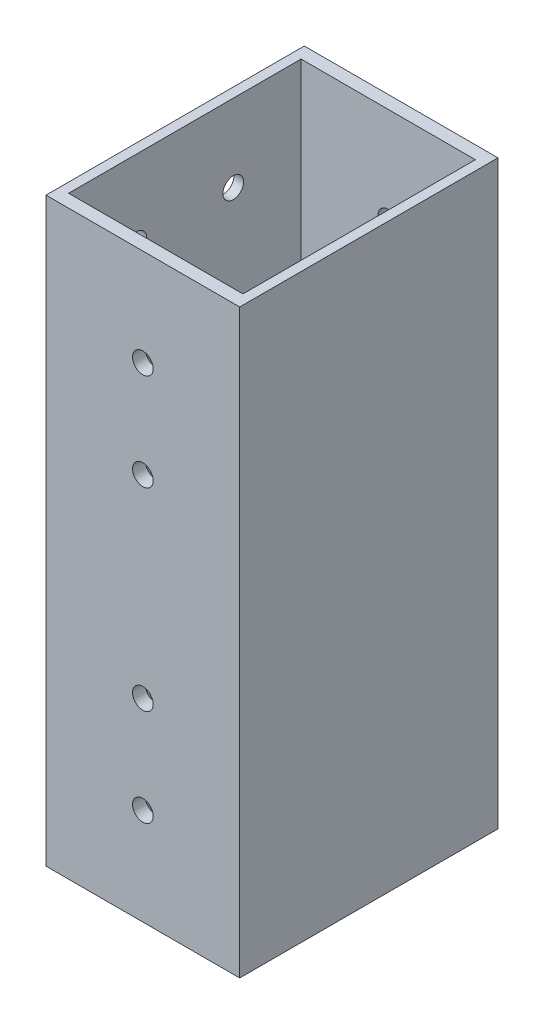
ISO-10303-21;
HEADER;
FILE_DESCRIPTION(('STEP AP214'),'2;1');
FILE_NAME('part.step','',(''),(''),'','','');
FILE_SCHEMA(('AUTOMOTIVE_DESIGN { 1 0 10303 214 1 1 1 1 }'));
ENDSEC;
DATA;
#1=APPLICATION_CONTEXT('core data for automotive mechanical design processes');
#2=APPLICATION_PROTOCOL_DEFINITION('international standard','automotive_design',2000,#1);
#3=PRODUCT_CONTEXT('',#1,'mechanical');
#4=PRODUCT('Part','Part','',(#3));
#5=PRODUCT_RELATED_PRODUCT_CATEGORY('part','',(#4));
#6=PRODUCT_DEFINITION_FORMATION('','',#4);
#7=PRODUCT_DEFINITION_CONTEXT('part definition',#1,'design');
#8=PRODUCT_DEFINITION('design','',#6,#7);
#9=PRODUCT_DEFINITION_SHAPE('','',#8);
#10=(LENGTH_UNIT() NAMED_UNIT(*) SI_UNIT(.MILLI.,.METRE.));
#11=(NAMED_UNIT(*) PLANE_ANGLE_UNIT() SI_UNIT($,.RADIAN.));
#12=(NAMED_UNIT(*) SI_UNIT($,.STERADIAN.) SOLID_ANGLE_UNIT());
#13=UNCERTAINTY_MEASURE_WITH_UNIT(LENGTH_MEASURE(1.E-05),#10,'distance_accuracy_value','');
#14=(GEOMETRIC_REPRESENTATION_CONTEXT(3) GLOBAL_UNCERTAINTY_ASSIGNED_CONTEXT((#13)) GLOBAL_UNIT_ASSIGNED_CONTEXT((#10,
#11,#12)) REPRESENTATION_CONTEXT('',''));
#15=CARTESIAN_POINT('',(0.,0.,0.));
#16=DIRECTION('',(0.,0.,1.));
#17=DIRECTION('',(1.,0.,0.));
#18=AXIS2_PLACEMENT_3D('',#15,#16,#17);
#19=CARTESIAN_POINT('',(0.,90.,0.));
#20=DIRECTION('',(0.,-1.,0.));
#21=DIRECTION('',(0.,0.,-1.));
#22=AXIS2_PLACEMENT_3D('',#19,#20,#21);
#23=PLANE('',#22);
#24=DIRECTION('',(0.,0.,-1.));
#25=VECTOR('',#24,1.);
#26=CARTESIAN_POINT('',(15.,90.,20.));
#27=LINE('',#26,#25);
#28=CARTESIAN_POINT('',(15.,90.,20.));
#29=VERTEX_POINT('',#28);
#30=CARTESIAN_POINT('',(15.,90.,-20.));
#31=VERTEX_POINT('',#30);
#32=EDGE_CURVE('E139',#29,#31,#27,.T.);
#33=ORIENTED_EDGE('',*,*,#32,.T.);
#34=DIRECTION('',(-1.,0.,0.));
#35=VECTOR('',#34,1.);
#36=CARTESIAN_POINT('',(-15.,90.,-20.));
#37=LINE('',#36,#35);
#38=CARTESIAN_POINT('',(-15.,90.,-20.));
#39=VERTEX_POINT('',#38);
#40=EDGE_CURVE('E142',#31,#39,#37,.T.);
#41=ORIENTED_EDGE('',*,*,#40,.T.);
#42=DIRECTION('',(0.,0.,1.));
#43=VECTOR('',#42,1.);
#44=CARTESIAN_POINT('',(-15.,90.,20.));
#45=LINE('',#44,#43);
#46=CARTESIAN_POINT('',(-15.,90.,20.));
#47=VERTEX_POINT('',#46);
#48=EDGE_CURVE('E145',#39,#47,#45,.T.);
#49=ORIENTED_EDGE('',*,*,#48,.T.);
#50=DIRECTION('',(1.,0.,0.));
#51=VECTOR('',#50,1.);
#52=CARTESIAN_POINT('',(-15.,90.,20.));
#53=LINE('',#52,#51);
#54=EDGE_CURVE('E147',#47,#29,#53,.T.);
#55=ORIENTED_EDGE('',*,*,#54,.T.);
#56=EDGE_LOOP('',(#33,#41,#49,#55));
#57=FACE_BOUND('',#56,.T.);
#58=DIRECTION('',(0.,0.,-1.));
#59=VECTOR('',#58,1.);
#60=CARTESIAN_POINT('',(13.5,90.,18.));
#61=LINE('',#60,#59);
#62=CARTESIAN_POINT('',(13.5,90.,18.));
#63=VERTEX_POINT('',#62);
#64=CARTESIAN_POINT('',(13.5,90.,-18.));
#65=VERTEX_POINT('',#64);
#66=EDGE_CURVE('E101',#63,#65,#61,.T.);
#67=ORIENTED_EDGE('',*,*,#66,.F.);
#68=DIRECTION('',(1.,0.,0.));
#69=VECTOR('',#68,1.);
#70=CARTESIAN_POINT('',(-13.5,90.,18.));
#71=LINE('',#70,#69);
#72=CARTESIAN_POINT('',(-13.5,90.,18.));
#73=VERTEX_POINT('',#72);
#74=EDGE_CURVE('E123',#73,#63,#71,.T.);
#75=ORIENTED_EDGE('',*,*,#74,.F.);
#76=DIRECTION('',(0.,0.,1.));
#77=VECTOR('',#76,1.);
#78=CARTESIAN_POINT('',(-13.5,90.,18.));
#79=LINE('',#78,#77);
#80=CARTESIAN_POINT('',(-13.5,90.,-18.));
#81=VERTEX_POINT('',#80);
#82=EDGE_CURVE('E121',#81,#73,#79,.T.);
#83=ORIENTED_EDGE('',*,*,#82,.F.);
#84=DIRECTION('',(-1.,0.,0.));
#85=VECTOR('',#84,1.);
#86=CARTESIAN_POINT('',(-13.5,90.,-18.));
#87=LINE('',#86,#85);
#88=EDGE_CURVE('E109',#65,#81,#87,.T.);
#89=ORIENTED_EDGE('',*,*,#88,.F.);
#90=EDGE_LOOP('',(#67,#75,#83,#89));
#91=FACE_BOUND('',#90,.T.);
#92=ADVANCED_FACE('F34',(#57,#91),#23,.F.);
#93=CARTESIAN_POINT('',(0.,0.,0.));
#94=DIRECTION('',(0.,-1.,0.));
#95=DIRECTION('',(0.,0.,-1.));
#96=AXIS2_PLACEMENT_3D('',#93,#94,#95);
#97=PLANE('',#96);
#98=DIRECTION('',(0.,0.,-1.));
#99=VECTOR('',#98,1.);
#100=CARTESIAN_POINT('',(15.,0.,20.));
#101=LINE('',#100,#99);
#102=CARTESIAN_POINT('',(15.,0.,20.));
#103=VERTEX_POINT('',#102);
#104=CARTESIAN_POINT('',(15.,0.,-20.));
#105=VERTEX_POINT('',#104);
#106=EDGE_CURVE('E117',#103,#105,#101,.T.);
#107=ORIENTED_EDGE('',*,*,#106,.F.);
#108=DIRECTION('',(1.,0.,0.));
#109=VECTOR('',#108,1.);
#110=CARTESIAN_POINT('',(-15.,0.,20.));
#111=LINE('',#110,#109);
#112=CARTESIAN_POINT('',(-15.,0.,20.));
#113=VERTEX_POINT('',#112);
#114=EDGE_CURVE('E143',#113,#103,#111,.T.);
#115=ORIENTED_EDGE('',*,*,#114,.F.);
#116=DIRECTION('',(0.,0.,1.));
#117=VECTOR('',#116,1.);
#118=CARTESIAN_POINT('',(-15.,0.,20.));
#119=LINE('',#118,#117);
#120=CARTESIAN_POINT('',(-15.,0.,-20.));
#121=VERTEX_POINT('',#120);
#122=EDGE_CURVE('E154',#121,#113,#119,.T.);
#123=ORIENTED_EDGE('',*,*,#122,.F.);
#124=DIRECTION('',(-1.,0.,0.));
#125=VECTOR('',#124,1.);
#126=CARTESIAN_POINT('',(-15.,0.,-20.));
#127=LINE('',#126,#125);
#128=EDGE_CURVE('E152',#105,#121,#127,.T.);
#129=ORIENTED_EDGE('',*,*,#128,.F.);
#130=EDGE_LOOP('',(#107,#115,#123,#129));
#131=FACE_BOUND('',#130,.T.);
#132=DIRECTION('',(1.,0.,0.));
#133=VECTOR('',#132,1.);
#134=CARTESIAN_POINT('',(-13.5,0.,18.));
#135=LINE('',#134,#133);
#136=CARTESIAN_POINT('',(-13.5,0.,18.));
#137=VERTEX_POINT('',#136);
#138=CARTESIAN_POINT('',(13.5,0.,18.));
#139=VERTEX_POINT('',#138);
#140=EDGE_CURVE('E110',#137,#139,#135,.T.);
#141=ORIENTED_EDGE('',*,*,#140,.T.);
#142=DIRECTION('',(0.,0.,-1.));
#143=VECTOR('',#142,1.);
#144=CARTESIAN_POINT('',(13.5,0.,18.));
#145=LINE('',#144,#143);
#146=CARTESIAN_POINT('',(13.5,0.,-18.));
#147=VERTEX_POINT('',#146);
#148=EDGE_CURVE('E59',#139,#147,#145,.T.);
#149=ORIENTED_EDGE('',*,*,#148,.T.);
#150=DIRECTION('',(-1.,0.,0.));
#151=VECTOR('',#150,1.);
#152=CARTESIAN_POINT('',(-13.5,0.,-18.));
#153=LINE('',#152,#151);
#154=CARTESIAN_POINT('',(-13.5,0.,-18.));
#155=VERTEX_POINT('',#154);
#156=EDGE_CURVE('E116',#147,#155,#153,.T.);
#157=ORIENTED_EDGE('',*,*,#156,.T.);
#158=DIRECTION('',(0.,0.,1.));
#159=VECTOR('',#158,1.);
#160=CARTESIAN_POINT('',(-13.5,0.,18.));
#161=LINE('',#160,#159);
#162=EDGE_CURVE('E131',#155,#137,#161,.T.);
#163=ORIENTED_EDGE('',*,*,#162,.T.);
#164=EDGE_LOOP('',(#141,#149,#157,#163));
#165=FACE_BOUND('',#164,.T.);
#166=ADVANCED_FACE('F264',(#131,#165),#97,.T.);
#167=CARTESIAN_POINT('',(15.,90.,20.));
#168=DIRECTION('',(-1.,0.,0.));
#169=DIRECTION('',(0.,0.,1.));
#170=AXIS2_PLACEMENT_3D('',#167,#168,#169);
#171=PLANE('',#170);
#172=ORIENTED_EDGE('',*,*,#106,.T.);
#173=DIRECTION('',(0.,-1.,0.));
#174=VECTOR('',#173,1.);
#175=CARTESIAN_POINT('',(15.,90.,-20.));
#176=LINE('',#175,#174);
#177=EDGE_CURVE('E11',#31,#105,#176,.T.);
#178=ORIENTED_EDGE('',*,*,#177,.F.);
#179=ORIENTED_EDGE('',*,*,#32,.F.);
#180=DIRECTION('',(0.,-1.,0.));
#181=VECTOR('',#180,1.);
#182=CARTESIAN_POINT('',(15.,90.,20.));
#183=LINE('',#182,#181);
#184=EDGE_CURVE('E149',#29,#103,#183,.T.);
#185=ORIENTED_EDGE('',*,*,#184,.T.);
#186=EDGE_LOOP('',(#172,#178,#179,#185));
#187=FACE_BOUND('',#186,.T.);
#188=ADVANCED_FACE('F36',(#187),#171,.F.);
#189=CARTESIAN_POINT('',(-15.,90.,-20.));
#190=DIRECTION('',(0.,0.,1.));
#191=DIRECTION('',(1.,0.,0.));
#192=AXIS2_PLACEMENT_3D('',#189,#190,#191);
#193=PLANE('',#192);
#194=CARTESIAN_POINT('',(0.,15.,-20.));
#195=DIRECTION('',(0.,0.,-1.));
#196=DIRECTION('',(-1.,0.,0.));
#197=AXIS2_PLACEMENT_3D('',#194,#195,#196);
#198=CIRCLE('',#197,1.6);
#199=CARTESIAN_POINT('',(-1.60000000000001,15.,-20.));
#200=VERTEX_POINT('',#199);
#201=EDGE_CURVE('E312',#200,#200,#198,.T.);
#202=ORIENTED_EDGE('',*,*,#201,.F.);
#203=EDGE_LOOP('',(#202));
#204=FACE_BOUND('',#203,.T.);
#205=CARTESIAN_POINT('',(0.,75.,-20.));
#206=DIRECTION('',(0.,0.,-1.));
#207=DIRECTION('',(-1.,0.,0.));
#208=AXIS2_PLACEMENT_3D('',#205,#206,#207);
#209=CIRCLE('',#208,1.6);
#210=CARTESIAN_POINT('',(-1.60000000000001,75.,-20.));
#211=VERTEX_POINT('',#210);
#212=EDGE_CURVE('E313',#211,#211,#209,.T.);
#213=ORIENTED_EDGE('',*,*,#212,.F.);
#214=EDGE_LOOP('',(#213));
#215=FACE_BOUND('',#214,.T.);
#216=CARTESIAN_POINT('',(0.,60.,-20.));
#217=DIRECTION('',(0.,0.,-1.));
#218=DIRECTION('',(-1.,0.,0.));
#219=AXIS2_PLACEMENT_3D('',#216,#217,#218);
#220=CIRCLE('',#219,1.6);
#221=CARTESIAN_POINT('',(-1.6,60.,-20.));
#222=VERTEX_POINT('',#221);
#223=EDGE_CURVE('E320',#222,#222,#220,.T.);
#224=ORIENTED_EDGE('',*,*,#223,.F.);
#225=EDGE_LOOP('',(#224));
#226=FACE_BOUND('',#225,.T.);
#227=CARTESIAN_POINT('',(0.,30.,-20.));
#228=DIRECTION('',(0.,0.,-1.));
#229=DIRECTION('',(-1.,0.,0.));
#230=AXIS2_PLACEMENT_3D('',#227,#228,#229);
#231=CIRCLE('',#230,1.6);
#232=CARTESIAN_POINT('',(-1.60000000000001,30.,-20.));
#233=VERTEX_POINT('',#232);
#234=EDGE_CURVE('E307',#233,#233,#231,.T.);
#235=ORIENTED_EDGE('',*,*,#234,.F.);
#236=EDGE_LOOP('',(#235));
#237=FACE_BOUND('',#236,.T.);
#238=ORIENTED_EDGE('',*,*,#128,.T.);
#239=DIRECTION('',(0.,-1.,0.));
#240=VECTOR('',#239,1.);
#241=CARTESIAN_POINT('',(-15.,90.,-20.));
#242=LINE('',#241,#240);
#243=EDGE_CURVE('E43',#39,#121,#242,.T.);
#244=ORIENTED_EDGE('',*,*,#243,.F.);
#245=ORIENTED_EDGE('',*,*,#40,.F.);
#246=ORIENTED_EDGE('',*,*,#177,.T.);
#247=EDGE_LOOP('',(#238,#244,#245,#246));
#248=FACE_BOUND('',#247,.T.);
#249=ADVANCED_FACE('F251',(#204,#215,#226,#237,#248),#193,.F.);
#250=CARTESIAN_POINT('',(-15.,90.,20.));
#251=DIRECTION('',(1.,0.,0.));
#252=DIRECTION('',(0.,0.,-1.));
#253=AXIS2_PLACEMENT_3D('',#250,#251,#252);
#254=PLANE('',#253);
#255=CARTESIAN_POINT('',(-15.,78.,-7.49999999999982));
#256=DIRECTION('',(-1.,0.,0.));
#257=DIRECTION('',(0.,0.,1.));
#258=AXIS2_PLACEMENT_3D('',#255,#256,#257);
#259=CIRCLE('',#258,1.6);
#260=CARTESIAN_POINT('',(-15.,78.,-5.89999999999982));
#261=VERTEX_POINT('',#260);
#262=EDGE_CURVE('E208',#261,#261,#259,.T.);
#263=ORIENTED_EDGE('',*,*,#262,.F.);
#264=EDGE_LOOP('',(#263));
#265=FACE_BOUND('',#264,.T.);
#266=CARTESIAN_POINT('',(-15.,62.,-7.49999999999982));
#267=DIRECTION('',(-1.,0.,0.));
#268=DIRECTION('',(0.,0.,1.));
#269=AXIS2_PLACEMENT_3D('',#266,#267,#268);
#270=CIRCLE('',#269,1.6);
#271=CARTESIAN_POINT('',(-15.,62.,-5.89999999999982));
#272=VERTEX_POINT('',#271);
#273=EDGE_CURVE('E215',#272,#272,#270,.T.);
#274=ORIENTED_EDGE('',*,*,#273,.F.);
#275=EDGE_LOOP('',(#274));
#276=FACE_BOUND('',#275,.T.);
#277=CARTESIAN_POINT('',(-15.,62.,7.50000000000019));
#278=DIRECTION('',(-1.,0.,0.));
#279=DIRECTION('',(0.,0.,1.));
#280=AXIS2_PLACEMENT_3D('',#277,#278,#279);
#281=CIRCLE('',#280,1.6);
#282=CARTESIAN_POINT('',(-15.,62.,9.10000000000019));
#283=VERTEX_POINT('',#282);
#284=EDGE_CURVE('E221',#283,#283,#281,.T.);
#285=ORIENTED_EDGE('',*,*,#284,.F.);
#286=EDGE_LOOP('',(#285));
#287=FACE_BOUND('',#286,.T.);
#288=CARTESIAN_POINT('',(-15.,11.9999999999997,7.50000000000035));
#289=DIRECTION('',(-1.,0.,0.));
#290=DIRECTION('',(0.,0.,1.));
#291=AXIS2_PLACEMENT_3D('',#288,#289,#290);
#292=CIRCLE('',#291,1.6);
#293=CARTESIAN_POINT('',(-15.,11.9999999999997,9.10000000000035));
#294=VERTEX_POINT('',#293);
#295=EDGE_CURVE('E227',#294,#294,#292,.T.);
#296=ORIENTED_EDGE('',*,*,#295,.F.);
#297=EDGE_LOOP('',(#296));
#298=FACE_BOUND('',#297,.T.);
#299=CARTESIAN_POINT('',(-15.,27.9999999999997,7.50000000000037));
#300=DIRECTION('',(-1.,0.,0.));
#301=DIRECTION('',(0.,0.,1.));
#302=AXIS2_PLACEMENT_3D('',#299,#300,#301);
#303=CIRCLE('',#302,1.6);
#304=CARTESIAN_POINT('',(-15.,27.9999999999997,9.10000000000037));
#305=VERTEX_POINT('',#304);
#306=EDGE_CURVE('E190',#305,#305,#303,.T.);
#307=ORIENTED_EDGE('',*,*,#306,.F.);
#308=EDGE_LOOP('',(#307));
#309=FACE_BOUND('',#308,.T.);
#310=CARTESIAN_POINT('',(-15.,27.9999999999997,-7.49999999999964));
#311=DIRECTION('',(-1.,0.,0.));
#312=DIRECTION('',(0.,0.,1.));
#313=AXIS2_PLACEMENT_3D('',#310,#311,#312);
#314=CIRCLE('',#313,1.6);
#315=CARTESIAN_POINT('',(-15.,27.9999999999997,-5.89999999999964));
#316=VERTEX_POINT('',#315);
#317=EDGE_CURVE('E197',#316,#316,#314,.T.);
#318=ORIENTED_EDGE('',*,*,#317,.F.);
#319=EDGE_LOOP('',(#318));
#320=FACE_BOUND('',#319,.T.);
#321=CARTESIAN_POINT('',(-15.,11.9999999999997,-7.49999999999966));
#322=DIRECTION('',(-1.,0.,0.));
#323=DIRECTION('',(0.,0.,1.));
#324=AXIS2_PLACEMENT_3D('',#321,#322,#323);
#325=CIRCLE('',#324,1.6);
#326=CARTESIAN_POINT('',(-15.,11.9999999999997,-5.89999999999966));
#327=VERTEX_POINT('',#326);
#328=EDGE_CURVE('E203',#327,#327,#325,.T.);
#329=ORIENTED_EDGE('',*,*,#328,.F.);
#330=EDGE_LOOP('',(#329));
#331=FACE_BOUND('',#330,.T.);
#332=CARTESIAN_POINT('',(-15.,78.,7.50000000000019));
#333=DIRECTION('',(-1.,0.,0.));
#334=DIRECTION('',(0.,0.,1.));
#335=AXIS2_PLACEMENT_3D('',#332,#333,#334);
#336=CIRCLE('',#335,1.6);
#337=CARTESIAN_POINT('',(-15.,78.,9.10000000000019));
#338=VERTEX_POINT('',#337);
#339=EDGE_CURVE('E129',#338,#338,#336,.T.);
#340=ORIENTED_EDGE('',*,*,#339,.F.);
#341=EDGE_LOOP('',(#340));
#342=FACE_BOUND('',#341,.T.);
#343=ORIENTED_EDGE('',*,*,#122,.T.);
#344=DIRECTION('',(0.,-1.,0.));
#345=VECTOR('',#344,1.);
#346=CARTESIAN_POINT('',(-15.,90.,20.));
#347=LINE('',#346,#345);
#348=EDGE_CURVE('E159',#47,#113,#347,.T.);
#349=ORIENTED_EDGE('',*,*,#348,.F.);
#350=ORIENTED_EDGE('',*,*,#48,.F.);
#351=ORIENTED_EDGE('',*,*,#243,.T.);
#352=EDGE_LOOP('',(#343,#349,#350,#351));
#353=FACE_BOUND('',#352,.T.);
#354=ADVANCED_FACE('F247',(#265,#276,#287,#298,#309,#320,#331,#342,#353),#254,.F.);
#355=CARTESIAN_POINT('',(-15.,90.,20.));
#356=DIRECTION('',(0.,0.,-1.));
#357=DIRECTION('',(-1.,0.,0.));
#358=AXIS2_PLACEMENT_3D('',#355,#356,#357);
#359=PLANE('',#358);
#360=CARTESIAN_POINT('',(0.,15.,20.));
#361=DIRECTION('',(0.,0.,-1.));
#362=DIRECTION('',(-1.,0.,0.));
#363=AXIS2_PLACEMENT_3D('',#360,#361,#362);
#364=CIRCLE('',#363,1.6);
#365=CARTESIAN_POINT('',(-1.60000000000001,15.,20.));
#366=VERTEX_POINT('',#365);
#367=EDGE_CURVE('E295',#366,#366,#364,.T.);
#368=ORIENTED_EDGE('',*,*,#367,.T.);
#369=EDGE_LOOP('',(#368));
#370=FACE_BOUND('',#369,.T.);
#371=CARTESIAN_POINT('',(0.,75.,20.));
#372=DIRECTION('',(0.,0.,-1.));
#373=DIRECTION('',(-1.,0.,0.));
#374=AXIS2_PLACEMENT_3D('',#371,#372,#373);
#375=CIRCLE('',#374,1.6);
#376=CARTESIAN_POINT('',(-1.60000000000001,75.,20.));
#377=VERTEX_POINT('',#376);
#378=EDGE_CURVE('E299',#377,#377,#375,.T.);
#379=ORIENTED_EDGE('',*,*,#378,.T.);
#380=EDGE_LOOP('',(#379));
#381=FACE_BOUND('',#380,.T.);
#382=CARTESIAN_POINT('',(0.,60.,20.));
#383=DIRECTION('',(0.,0.,-1.));
#384=DIRECTION('',(-1.,0.,0.));
#385=AXIS2_PLACEMENT_3D('',#382,#383,#384);
#386=CIRCLE('',#385,1.6);
#387=CARTESIAN_POINT('',(-1.6,60.,20.));
#388=VERTEX_POINT('',#387);
#389=EDGE_CURVE('E303',#388,#388,#386,.T.);
#390=ORIENTED_EDGE('',*,*,#389,.T.);
#391=EDGE_LOOP('',(#390));
#392=FACE_BOUND('',#391,.T.);
#393=CARTESIAN_POINT('',(0.,30.,20.));
#394=DIRECTION('',(0.,0.,-1.));
#395=DIRECTION('',(-1.,0.,0.));
#396=AXIS2_PLACEMENT_3D('',#393,#394,#395);
#397=CIRCLE('',#396,1.6);
#398=CARTESIAN_POINT('',(-1.60000000000001,30.,20.));
#399=VERTEX_POINT('',#398);
#400=EDGE_CURVE('E168',#399,#399,#397,.T.);
#401=ORIENTED_EDGE('',*,*,#400,.T.);
#402=EDGE_LOOP('',(#401));
#403=FACE_BOUND('',#402,.T.);
#404=ORIENTED_EDGE('',*,*,#114,.T.);
#405=ORIENTED_EDGE('',*,*,#184,.F.);
#406=ORIENTED_EDGE('',*,*,#54,.F.);
#407=ORIENTED_EDGE('',*,*,#348,.T.);
#408=EDGE_LOOP('',(#404,#405,#406,#407));
#409=FACE_BOUND('',#408,.T.);
#410=ADVANCED_FACE('F250',(#370,#381,#392,#403,#409),#359,.F.);
#411=CARTESIAN_POINT('',(13.5,90.,18.));
#412=DIRECTION('',(-1.,0.,0.));
#413=DIRECTION('',(0.,0.,1.));
#414=AXIS2_PLACEMENT_3D('',#411,#412,#413);
#415=PLANE('',#414);
#416=ORIENTED_EDGE('',*,*,#148,.F.);
#417=DIRECTION('',(0.,-1.,0.));
#418=VECTOR('',#417,1.);
#419=CARTESIAN_POINT('',(13.5,90.,18.));
#420=LINE('',#419,#418);
#421=EDGE_CURVE('E105',#63,#139,#420,.T.);
#422=ORIENTED_EDGE('',*,*,#421,.F.);
#423=ORIENTED_EDGE('',*,*,#66,.T.);
#424=DIRECTION('',(0.,-1.,0.));
#425=VECTOR('',#424,1.);
#426=CARTESIAN_POINT('',(13.5,90.,-18.));
#427=LINE('',#426,#425);
#428=EDGE_CURVE('E104',#65,#147,#427,.T.);
#429=ORIENTED_EDGE('',*,*,#428,.T.);
#430=EDGE_LOOP('',(#416,#422,#423,#429));
#431=FACE_BOUND('',#430,.T.);
#432=ADVANCED_FACE('F103',(#431),#415,.T.);
#433=CARTESIAN_POINT('',(-13.5,90.,-18.));
#434=DIRECTION('',(0.,0.,1.));
#435=DIRECTION('',(1.,0.,0.));
#436=AXIS2_PLACEMENT_3D('',#433,#434,#435);
#437=PLANE('',#436);
#438=CARTESIAN_POINT('',(0.,15.,-18.));
#439=DIRECTION('',(0.,0.,1.));
#440=DIRECTION('',(1.,0.,0.));
#441=AXIS2_PLACEMENT_3D('',#438,#439,#440);
#442=CIRCLE('',#441,1.6);
#443=CARTESIAN_POINT('',(1.6,15.,-18.));
#444=VERTEX_POINT('',#443);
#445=EDGE_CURVE('E186',#444,#444,#442,.T.);
#446=ORIENTED_EDGE('',*,*,#445,.F.);
#447=EDGE_LOOP('',(#446));
#448=FACE_BOUND('',#447,.T.);
#449=CARTESIAN_POINT('',(0.,75.,-18.));
#450=DIRECTION('',(0.,0.,1.));
#451=DIRECTION('',(1.,0.,0.));
#452=AXIS2_PLACEMENT_3D('',#449,#450,#451);
#453=CIRCLE('',#452,1.6);
#454=CARTESIAN_POINT('',(1.6,75.,-18.));
#455=VERTEX_POINT('',#454);
#456=EDGE_CURVE('E174',#455,#455,#453,.T.);
#457=ORIENTED_EDGE('',*,*,#456,.F.);
#458=EDGE_LOOP('',(#457));
#459=FACE_BOUND('',#458,.T.);
#460=CARTESIAN_POINT('',(0.,60.,-18.));
#461=DIRECTION('',(0.,0.,1.));
#462=DIRECTION('',(1.,0.,0.));
#463=AXIS2_PLACEMENT_3D('',#460,#461,#462);
#464=CIRCLE('',#463,1.6);
#465=CARTESIAN_POINT('',(1.59999999999999,60.,-18.));
#466=VERTEX_POINT('',#465);
#467=EDGE_CURVE('E171',#466,#466,#464,.T.);
#468=ORIENTED_EDGE('',*,*,#467,.F.);
#469=EDGE_LOOP('',(#468));
#470=FACE_BOUND('',#469,.T.);
#471=CARTESIAN_POINT('',(0.,30.,-18.));
#472=DIRECTION('',(0.,0.,1.));
#473=DIRECTION('',(1.,0.,0.));
#474=AXIS2_PLACEMENT_3D('',#471,#472,#473);
#475=CIRCLE('',#474,1.6);
#476=CARTESIAN_POINT('',(1.6,30.,-18.));
#477=VERTEX_POINT('',#476);
#478=EDGE_CURVE('E167',#477,#477,#475,.T.);
#479=ORIENTED_EDGE('',*,*,#478,.F.);
#480=EDGE_LOOP('',(#479));
#481=FACE_BOUND('',#480,.T.);
#482=ORIENTED_EDGE('',*,*,#156,.F.);
#483=ORIENTED_EDGE('',*,*,#428,.F.);
#484=ORIENTED_EDGE('',*,*,#88,.T.);
#485=DIRECTION('',(0.,-1.,0.));
#486=VECTOR('',#485,1.);
#487=CARTESIAN_POINT('',(-13.5,90.,-18.));
#488=LINE('',#487,#486);
#489=EDGE_CURVE('E118',#81,#155,#488,.T.);
#490=ORIENTED_EDGE('',*,*,#489,.T.);
#491=EDGE_LOOP('',(#482,#483,#484,#490));
#492=FACE_BOUND('',#491,.T.);
#493=ADVANCED_FACE('F113',(#448,#459,#470,#481,#492),#437,.T.);
#494=CARTESIAN_POINT('',(-13.5,90.,18.));
#495=DIRECTION('',(1.,0.,0.));
#496=DIRECTION('',(0.,0.,-1.));
#497=AXIS2_PLACEMENT_3D('',#494,#495,#496);
#498=PLANE('',#497);
#499=CARTESIAN_POINT('',(-13.5,78.,-7.49999999999982));
#500=DIRECTION('',(1.,0.,0.));
#501=DIRECTION('',(0.,0.,-1.));
#502=AXIS2_PLACEMENT_3D('',#499,#500,#501);
#503=CIRCLE('',#502,1.6);
#504=CARTESIAN_POINT('',(-13.5,78.,-9.09999999999982));
#505=VERTEX_POINT('',#504);
#506=EDGE_CURVE('E212',#505,#505,#503,.F.);
#507=ORIENTED_EDGE('',*,*,#506,.T.);
#508=EDGE_LOOP('',(#507));
#509=FACE_BOUND('',#508,.T.);
#510=CARTESIAN_POINT('',(-13.5,62.,-7.49999999999982));
#511=DIRECTION('',(1.,0.,0.));
#512=DIRECTION('',(0.,0.,-1.));
#513=AXIS2_PLACEMENT_3D('',#510,#511,#512);
#514=CIRCLE('',#513,1.6);
#515=CARTESIAN_POINT('',(-13.5,62.,-9.09999999999982));
#516=VERTEX_POINT('',#515);
#517=EDGE_CURVE('E218',#516,#516,#514,.F.);
#518=ORIENTED_EDGE('',*,*,#517,.T.);
#519=EDGE_LOOP('',(#518));
#520=FACE_BOUND('',#519,.T.);
#521=CARTESIAN_POINT('',(-13.5,62.,7.50000000000019));
#522=DIRECTION('',(1.,0.,0.));
#523=DIRECTION('',(0.,0.,-1.));
#524=AXIS2_PLACEMENT_3D('',#521,#522,#523);
#525=CIRCLE('',#524,1.6);
#526=CARTESIAN_POINT('',(-13.5,62.,5.90000000000019));
#527=VERTEX_POINT('',#526);
#528=EDGE_CURVE('E224',#527,#527,#525,.F.);
#529=ORIENTED_EDGE('',*,*,#528,.T.);
#530=EDGE_LOOP('',(#529));
#531=FACE_BOUND('',#530,.T.);
#532=CARTESIAN_POINT('',(-13.5,11.9999999999997,7.50000000000035));
#533=DIRECTION('',(1.,0.,0.));
#534=DIRECTION('',(0.,0.,-1.));
#535=AXIS2_PLACEMENT_3D('',#532,#533,#534);
#536=CIRCLE('',#535,1.6);
#537=CARTESIAN_POINT('',(-13.5,11.9999999999997,5.90000000000035));
#538=VERTEX_POINT('',#537);
#539=EDGE_CURVE('E193',#538,#538,#536,.F.);
#540=ORIENTED_EDGE('',*,*,#539,.T.);
#541=EDGE_LOOP('',(#540));
#542=FACE_BOUND('',#541,.T.);
#543=CARTESIAN_POINT('',(-13.5,27.9999999999997,7.50000000000037));
#544=DIRECTION('',(1.,0.,0.));
#545=DIRECTION('',(0.,0.,-1.));
#546=AXIS2_PLACEMENT_3D('',#543,#544,#545);
#547=CIRCLE('',#546,1.6);
#548=CARTESIAN_POINT('',(-13.5,27.9999999999997,5.90000000000037));
#549=VERTEX_POINT('',#548);
#550=EDGE_CURVE('E194',#549,#549,#547,.F.);
#551=ORIENTED_EDGE('',*,*,#550,.T.);
#552=EDGE_LOOP('',(#551));
#553=FACE_BOUND('',#552,.T.);
#554=CARTESIAN_POINT('',(-13.5,27.9999999999997,-7.49999999999964));
#555=DIRECTION('',(1.,0.,0.));
#556=DIRECTION('',(0.,0.,-1.));
#557=AXIS2_PLACEMENT_3D('',#554,#555,#556);
#558=CIRCLE('',#557,1.6);
#559=CARTESIAN_POINT('',(-13.5,27.9999999999997,-9.09999999999964));
#560=VERTEX_POINT('',#559);
#561=EDGE_CURVE('E200',#560,#560,#558,.F.);
#562=ORIENTED_EDGE('',*,*,#561,.T.);
#563=EDGE_LOOP('',(#562));
#564=FACE_BOUND('',#563,.T.);
#565=CARTESIAN_POINT('',(-13.5,11.9999999999997,-7.49999999999966));
#566=DIRECTION('',(1.,0.,0.));
#567=DIRECTION('',(0.,0.,-1.));
#568=AXIS2_PLACEMENT_3D('',#565,#566,#567);
#569=CIRCLE('',#568,1.6);
#570=CARTESIAN_POINT('',(-13.5,11.9999999999997,-9.09999999999966));
#571=VERTEX_POINT('',#570);
#572=EDGE_CURVE('E189',#571,#571,#569,.F.);
#573=ORIENTED_EDGE('',*,*,#572,.T.);
#574=EDGE_LOOP('',(#573));
#575=FACE_BOUND('',#574,.T.);
#576=CARTESIAN_POINT('',(-13.5,78.,7.50000000000019));
#577=DIRECTION('',(1.,0.,0.));
#578=DIRECTION('',(0.,0.,-1.));
#579=AXIS2_PLACEMENT_3D('',#576,#577,#578);
#580=CIRCLE('',#579,1.6);
#581=CARTESIAN_POINT('',(-13.5,78.,5.90000000000019));
#582=VERTEX_POINT('',#581);
#583=EDGE_CURVE('E211',#582,#582,#580,.F.);
#584=ORIENTED_EDGE('',*,*,#583,.T.);
#585=EDGE_LOOP('',(#584));
#586=FACE_BOUND('',#585,.T.);
#587=ORIENTED_EDGE('',*,*,#162,.F.);
#588=ORIENTED_EDGE('',*,*,#489,.F.);
#589=ORIENTED_EDGE('',*,*,#82,.T.);
#590=DIRECTION('',(0.,-1.,0.));
#591=VECTOR('',#590,1.);
#592=CARTESIAN_POINT('',(-13.5,90.,18.));
#593=LINE('',#592,#591);
#594=EDGE_CURVE('E51',#73,#137,#593,.T.);
#595=ORIENTED_EDGE('',*,*,#594,.T.);
#596=EDGE_LOOP('',(#587,#588,#589,#595));
#597=FACE_BOUND('',#596,.T.);
#598=ADVANCED_FACE('F236',(#509,#520,#531,#542,#553,#564,#575,#586,#597),#498,.T.);
#599=CARTESIAN_POINT('',(-13.5,90.,18.));
#600=DIRECTION('',(0.,0.,-1.));
#601=DIRECTION('',(-1.,0.,0.));
#602=AXIS2_PLACEMENT_3D('',#599,#600,#601);
#603=PLANE('',#602);
#604=CARTESIAN_POINT('',(0.,15.,18.));
#605=DIRECTION('',(0.,0.,-1.));
#606=DIRECTION('',(-1.,0.,0.));
#607=AXIS2_PLACEMENT_3D('',#604,#605,#606);
#608=CIRCLE('',#607,1.6);
#609=CARTESIAN_POINT('',(-1.60000000000001,15.,18.));
#610=VERTEX_POINT('',#609);
#611=EDGE_CURVE('E38',#610,#610,#608,.T.);
#612=ORIENTED_EDGE('',*,*,#611,.F.);
#613=EDGE_LOOP('',(#612));
#614=FACE_BOUND('',#613,.T.);
#615=CARTESIAN_POINT('',(0.,75.,18.));
#616=DIRECTION('',(0.,0.,-1.));
#617=DIRECTION('',(-1.,0.,0.));
#618=AXIS2_PLACEMENT_3D('',#615,#616,#617);
#619=CIRCLE('',#618,1.6);
#620=CARTESIAN_POINT('',(-1.60000000000001,75.,18.));
#621=VERTEX_POINT('',#620);
#622=EDGE_CURVE('E172',#621,#621,#619,.T.);
#623=ORIENTED_EDGE('',*,*,#622,.F.);
#624=EDGE_LOOP('',(#623));
#625=FACE_BOUND('',#624,.T.);
#626=CARTESIAN_POINT('',(0.,60.,18.));
#627=DIRECTION('',(0.,0.,-1.));
#628=DIRECTION('',(-1.,0.,0.));
#629=AXIS2_PLACEMENT_3D('',#626,#627,#628);
#630=CIRCLE('',#629,1.6);
#631=CARTESIAN_POINT('',(-1.6,60.,18.));
#632=VERTEX_POINT('',#631);
#633=EDGE_CURVE('E169',#632,#632,#630,.T.);
#634=ORIENTED_EDGE('',*,*,#633,.F.);
#635=EDGE_LOOP('',(#634));
#636=FACE_BOUND('',#635,.T.);
#637=CARTESIAN_POINT('',(0.,30.,18.));
#638=DIRECTION('',(0.,0.,-1.));
#639=DIRECTION('',(-1.,0.,0.));
#640=AXIS2_PLACEMENT_3D('',#637,#638,#639);
#641=CIRCLE('',#640,1.6);
#642=CARTESIAN_POINT('',(-1.60000000000001,30.,18.));
#643=VERTEX_POINT('',#642);
#644=EDGE_CURVE('E164',#643,#643,#641,.T.);
#645=ORIENTED_EDGE('',*,*,#644,.F.);
#646=EDGE_LOOP('',(#645));
#647=FACE_BOUND('',#646,.T.);
#648=ORIENTED_EDGE('',*,*,#140,.F.);
#649=ORIENTED_EDGE('',*,*,#594,.F.);
#650=ORIENTED_EDGE('',*,*,#74,.T.);
#651=ORIENTED_EDGE('',*,*,#421,.T.);
#652=EDGE_LOOP('',(#648,#649,#650,#651));
#653=FACE_BOUND('',#652,.T.);
#654=ADVANCED_FACE('F243',(#614,#625,#636,#647,#653),#603,.T.);
#655=CARTESIAN_POINT('',(15.001,78.,7.50000000000019));
#656=DIRECTION('',(-1.,0.,0.));
#657=DIRECTION('',(0.,0.,1.));
#658=AXIS2_PLACEMENT_3D('',#655,#656,#657);
#659=CYLINDRICAL_SURFACE('',#658,1.6);
#660=ORIENTED_EDGE('',*,*,#583,.F.);
#661=EDGE_LOOP('',(#660));
#662=FACE_BOUND('',#661,.T.);
#663=ORIENTED_EDGE('',*,*,#339,.T.);
#664=EDGE_LOOP('',(#663));
#665=FACE_BOUND('',#664,.T.);
#666=ADVANCED_FACE('F239',(#662,#665),#659,.F.);
#667=CARTESIAN_POINT('',(15.001,11.9999999999997,-7.49999999999966));
#668=DIRECTION('',(-1.,0.,0.));
#669=DIRECTION('',(0.,0.,1.));
#670=AXIS2_PLACEMENT_3D('',#667,#668,#669);
#671=CYLINDRICAL_SURFACE('',#670,1.6);
#672=ORIENTED_EDGE('',*,*,#572,.F.);
#673=EDGE_LOOP('',(#672));
#674=FACE_BOUND('',#673,.T.);
#675=ORIENTED_EDGE('',*,*,#328,.T.);
#676=EDGE_LOOP('',(#675));
#677=FACE_BOUND('',#676,.T.);
#678=ADVANCED_FACE('F242',(#674,#677),#671,.F.);
#679=CARTESIAN_POINT('',(15.001,27.9999999999997,-7.49999999999964));
#680=DIRECTION('',(-1.,0.,0.));
#681=DIRECTION('',(0.,0.,1.));
#682=AXIS2_PLACEMENT_3D('',#679,#680,#681);
#683=CYLINDRICAL_SURFACE('',#682,1.6);
#684=ORIENTED_EDGE('',*,*,#561,.F.);
#685=EDGE_LOOP('',(#684));
#686=FACE_BOUND('',#685,.T.);
#687=ORIENTED_EDGE('',*,*,#317,.T.);
#688=EDGE_LOOP('',(#687));
#689=FACE_BOUND('',#688,.T.);
#690=ADVANCED_FACE('F389',(#686,#689),#683,.F.);
#691=CARTESIAN_POINT('',(15.001,27.9999999999997,7.50000000000037));
#692=DIRECTION('',(-1.,0.,0.));
#693=DIRECTION('',(0.,0.,1.));
#694=AXIS2_PLACEMENT_3D('',#691,#692,#693);
#695=CYLINDRICAL_SURFACE('',#694,1.6);
#696=ORIENTED_EDGE('',*,*,#550,.F.);
#697=EDGE_LOOP('',(#696));
#698=FACE_BOUND('',#697,.T.);
#699=ORIENTED_EDGE('',*,*,#306,.T.);
#700=EDGE_LOOP('',(#699));
#701=FACE_BOUND('',#700,.T.);
#702=ADVANCED_FACE('F379',(#698,#701),#695,.F.);
#703=CARTESIAN_POINT('',(15.001,11.9999999999997,7.50000000000035));
#704=DIRECTION('',(-1.,0.,0.));
#705=DIRECTION('',(0.,0.,1.));
#706=AXIS2_PLACEMENT_3D('',#703,#704,#705);
#707=CYLINDRICAL_SURFACE('',#706,1.6);
#708=ORIENTED_EDGE('',*,*,#539,.F.);
#709=EDGE_LOOP('',(#708));
#710=FACE_BOUND('',#709,.T.);
#711=ORIENTED_EDGE('',*,*,#295,.T.);
#712=EDGE_LOOP('',(#711));
#713=FACE_BOUND('',#712,.T.);
#714=ADVANCED_FACE('F375',(#710,#713),#707,.F.);
#715=CARTESIAN_POINT('',(15.001,62.,7.50000000000019));
#716=DIRECTION('',(-1.,0.,0.));
#717=DIRECTION('',(0.,0.,1.));
#718=AXIS2_PLACEMENT_3D('',#715,#716,#717);
#719=CYLINDRICAL_SURFACE('',#718,1.6);
#720=ORIENTED_EDGE('',*,*,#528,.F.);
#721=EDGE_LOOP('',(#720));
#722=FACE_BOUND('',#721,.T.);
#723=ORIENTED_EDGE('',*,*,#284,.T.);
#724=EDGE_LOOP('',(#723));
#725=FACE_BOUND('',#724,.T.);
#726=ADVANCED_FACE('F378',(#722,#725),#719,.F.);
#727=CARTESIAN_POINT('',(15.001,62.,-7.49999999999982));
#728=DIRECTION('',(-1.,0.,0.));
#729=DIRECTION('',(0.,0.,1.));
#730=AXIS2_PLACEMENT_3D('',#727,#728,#729);
#731=CYLINDRICAL_SURFACE('',#730,1.6);
#732=ORIENTED_EDGE('',*,*,#517,.F.);
#733=EDGE_LOOP('',(#732));
#734=FACE_BOUND('',#733,.T.);
#735=ORIENTED_EDGE('',*,*,#273,.T.);
#736=EDGE_LOOP('',(#735));
#737=FACE_BOUND('',#736,.T.);
#738=ADVANCED_FACE('F357',(#734,#737),#731,.F.);
#739=CARTESIAN_POINT('',(15.001,78.,-7.49999999999982));
#740=DIRECTION('',(-1.,0.,0.));
#741=DIRECTION('',(0.,0.,1.));
#742=AXIS2_PLACEMENT_3D('',#739,#740,#741);
#743=CYLINDRICAL_SURFACE('',#742,1.6);
#744=ORIENTED_EDGE('',*,*,#506,.F.);
#745=EDGE_LOOP('',(#744));
#746=FACE_BOUND('',#745,.T.);
#747=ORIENTED_EDGE('',*,*,#262,.T.);
#748=EDGE_LOOP('',(#747));
#749=FACE_BOUND('',#748,.T.);
#750=ADVANCED_FACE('F350',(#746,#749),#743,.F.);
#751=CARTESIAN_POINT('',(0.,30.,20.));
#752=DIRECTION('',(0.,0.,-1.));
#753=DIRECTION('',(-1.,0.,0.));
#754=AXIS2_PLACEMENT_3D('',#751,#752,#753);
#755=CYLINDRICAL_SURFACE('',#754,1.6);
#756=ORIENTED_EDGE('',*,*,#644,.T.);
#757=EDGE_LOOP('',(#756));
#758=FACE_BOUND('',#757,.T.);
#759=ORIENTED_EDGE('',*,*,#400,.F.);
#760=EDGE_LOOP('',(#759));
#761=FACE_BOUND('',#760,.T.);
#762=ADVANCED_FACE('F334',(#758,#761),#755,.F.);
#763=CARTESIAN_POINT('',(0.,60.,20.));
#764=DIRECTION('',(0.,0.,-1.));
#765=DIRECTION('',(-1.,0.,0.));
#766=AXIS2_PLACEMENT_3D('',#763,#764,#765);
#767=CYLINDRICAL_SURFACE('',#766,1.6);
#768=ORIENTED_EDGE('',*,*,#633,.T.);
#769=EDGE_LOOP('',(#768));
#770=FACE_BOUND('',#769,.T.);
#771=ORIENTED_EDGE('',*,*,#389,.F.);
#772=EDGE_LOOP('',(#771));
#773=FACE_BOUND('',#772,.T.);
#774=ADVANCED_FACE('F341',(#770,#773),#767,.F.);
#775=CARTESIAN_POINT('',(0.,75.,20.));
#776=DIRECTION('',(0.,0.,-1.));
#777=DIRECTION('',(-1.,0.,0.));
#778=AXIS2_PLACEMENT_3D('',#775,#776,#777);
#779=CYLINDRICAL_SURFACE('',#778,1.6);
#780=ORIENTED_EDGE('',*,*,#622,.T.);
#781=EDGE_LOOP('',(#780));
#782=FACE_BOUND('',#781,.T.);
#783=ORIENTED_EDGE('',*,*,#378,.F.);
#784=EDGE_LOOP('',(#783));
#785=FACE_BOUND('',#784,.T.);
#786=ADVANCED_FACE('F342',(#782,#785),#779,.F.);
#787=CARTESIAN_POINT('',(0.,15.,20.));
#788=DIRECTION('',(0.,0.,-1.));
#789=DIRECTION('',(-1.,0.,0.));
#790=AXIS2_PLACEMENT_3D('',#787,#788,#789);
#791=CYLINDRICAL_SURFACE('',#790,1.6);
#792=ORIENTED_EDGE('',*,*,#611,.T.);
#793=EDGE_LOOP('',(#792));
#794=FACE_BOUND('',#793,.T.);
#795=ORIENTED_EDGE('',*,*,#367,.F.);
#796=EDGE_LOOP('',(#795));
#797=FACE_BOUND('',#796,.T.);
#798=ADVANCED_FACE('F331',(#794,#797),#791,.F.);
#799=ORIENTED_EDGE('',*,*,#478,.T.);
#800=EDGE_LOOP('',(#799));
#801=FACE_BOUND('',#800,.T.);
#802=ORIENTED_EDGE('',*,*,#234,.T.);
#803=EDGE_LOOP('',(#802));
#804=FACE_BOUND('',#803,.T.);
#805=ADVANCED_FACE('F329',(#801,#804),#755,.F.);
#806=ORIENTED_EDGE('',*,*,#467,.T.);
#807=EDGE_LOOP('',(#806));
#808=FACE_BOUND('',#807,.T.);
#809=ORIENTED_EDGE('',*,*,#223,.T.);
#810=EDGE_LOOP('',(#809));
#811=FACE_BOUND('',#810,.T.);
#812=ADVANCED_FACE('F324',(#808,#811),#767,.F.);
#813=ORIENTED_EDGE('',*,*,#456,.T.);
#814=EDGE_LOOP('',(#813));
#815=FACE_BOUND('',#814,.T.);
#816=ORIENTED_EDGE('',*,*,#212,.T.);
#817=EDGE_LOOP('',(#816));
#818=FACE_BOUND('',#817,.T.);
#819=ADVANCED_FACE('F339',(#815,#818),#779,.F.);
#820=ORIENTED_EDGE('',*,*,#445,.T.);
#821=EDGE_LOOP('',(#820));
#822=FACE_BOUND('',#821,.T.);
#823=ORIENTED_EDGE('',*,*,#201,.T.);
#824=EDGE_LOOP('',(#823));
#825=FACE_BOUND('',#824,.T.);
#826=ADVANCED_FACE('F345',(#822,#825),#791,.F.);
#827=CLOSED_SHELL('',(#92,#166,#188,#249,#354,#410,#432,#493,#598,#654,#666,#678,#690,#702,#714,
#726,#738,#750,#762,#774,#786,#798,#805,#812,#819,#826));
#828=MANIFOLD_SOLID_BREP('B2',#827);
#829=ADVANCED_BREP_SHAPE_REPRESENTATION('',(#18,#828),#14);
#830=SHAPE_DEFINITION_REPRESENTATION(#9,#829);
ENDSEC;
END-ISO-10303-21;
